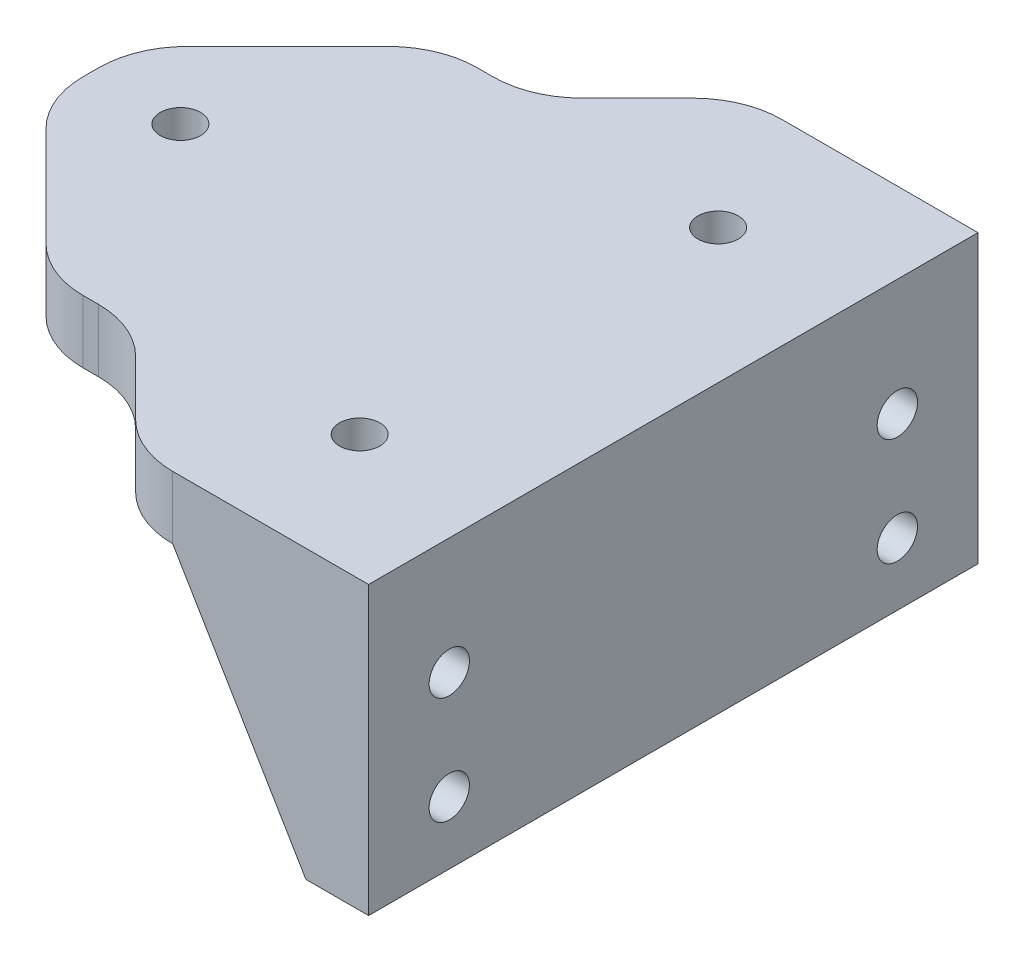
ISO-10303-21;
HEADER;
FILE_DESCRIPTION(('STEP AP214'),'2;1');
FILE_NAME('part.step','',(''),(''),'','','');
FILE_SCHEMA(('AUTOMOTIVE_DESIGN { 1 0 10303 214 1 1 1 1 }'));
ENDSEC;
DATA;
#1=APPLICATION_CONTEXT('core data for automotive mechanical design processes');
#2=APPLICATION_PROTOCOL_DEFINITION('international standard','automotive_design',2000,#1);
#3=PRODUCT_CONTEXT('',#1,'mechanical');
#4=PRODUCT('Part','Part','',(#3));
#5=PRODUCT_RELATED_PRODUCT_CATEGORY('part','',(#4));
#6=PRODUCT_DEFINITION_FORMATION('','',#4);
#7=PRODUCT_DEFINITION_CONTEXT('part definition',#1,'design');
#8=PRODUCT_DEFINITION('design','',#6,#7);
#9=PRODUCT_DEFINITION_SHAPE('','',#8);
#10=(LENGTH_UNIT() NAMED_UNIT(*) SI_UNIT(.MILLI.,.METRE.));
#11=(NAMED_UNIT(*) PLANE_ANGLE_UNIT() SI_UNIT($,.RADIAN.));
#12=(NAMED_UNIT(*) SI_UNIT($,.STERADIAN.) SOLID_ANGLE_UNIT());
#13=UNCERTAINTY_MEASURE_WITH_UNIT(LENGTH_MEASURE(1.E-05),#10,'distance_accuracy_value','');
#14=(GEOMETRIC_REPRESENTATION_CONTEXT(3) GLOBAL_UNCERTAINTY_ASSIGNED_CONTEXT((#13)) GLOBAL_UNIT_ASSIGNED_CONTEXT((#10,
#11,#12)) REPRESENTATION_CONTEXT('',''));
#15=CARTESIAN_POINT('',(0.,0.,0.));
#16=DIRECTION('',(0.,0.,1.));
#17=DIRECTION('',(1.,0.,0.));
#18=AXIS2_PLACEMENT_3D('',#15,#16,#17);
#19=CARTESIAN_POINT('',(58.,-25.,0.));
#20=DIRECTION('',(1.,0.,0.));
#21=DIRECTION('',(0.,0.,-1.));
#22=AXIS2_PLACEMENT_3D('',#19,#20,#21);
#23=PLANE('',#22);
#24=CARTESIAN_POINT('',(58.,-6.,-59.));
#25=DIRECTION('',(1.,0.,0.));
#26=DIRECTION('',(0.,0.,-1.));
#27=AXIS2_PLACEMENT_3D('',#24,#25,#26);
#28=CIRCLE('',#27,2.24999999999999);
#29=CARTESIAN_POINT('',(58.,-6.,-61.25));
#30=VERTEX_POINT('',#29);
#31=EDGE_CURVE('E873',#30,#30,#28,.T.);
#32=ORIENTED_EDGE('',*,*,#31,.T.);
#33=EDGE_LOOP('',(#32));
#34=FACE_BOUND('',#33,.T.);
#35=CARTESIAN_POINT('',(58.,-18.,-59.));
#36=DIRECTION('',(1.,0.,0.));
#37=DIRECTION('',(0.,0.,-1.));
#38=AXIS2_PLACEMENT_3D('',#35,#36,#37);
#39=CIRCLE('',#38,2.24999999999999);
#40=CARTESIAN_POINT('',(58.,-18.,-61.25));
#41=VERTEX_POINT('',#40);
#42=EDGE_CURVE('E43',#41,#41,#39,.T.);
#43=ORIENTED_EDGE('',*,*,#42,.T.);
#44=EDGE_LOOP('',(#43));
#45=FACE_BOUND('',#44,.T.);
#46=CARTESIAN_POINT('',(58.,-6.,-9.));
#47=DIRECTION('',(1.,0.,0.));
#48=DIRECTION('',(0.,0.,-1.));
#49=AXIS2_PLACEMENT_3D('',#46,#47,#48);
#50=CIRCLE('',#49,2.24999999999999);
#51=CARTESIAN_POINT('',(58.,-6.,-11.25));
#52=VERTEX_POINT('',#51);
#53=EDGE_CURVE('E428',#52,#52,#50,.T.);
#54=ORIENTED_EDGE('',*,*,#53,.T.);
#55=EDGE_LOOP('',(#54));
#56=FACE_BOUND('',#55,.T.);
#57=CARTESIAN_POINT('',(58.,-18.,-9.));
#58=DIRECTION('',(1.,0.,0.));
#59=DIRECTION('',(0.,0.,-1.));
#60=AXIS2_PLACEMENT_3D('',#57,#58,#59);
#61=CIRCLE('',#60,2.24999999999999);
#62=CARTESIAN_POINT('',(58.,-18.,-11.25));
#63=VERTEX_POINT('',#62);
#64=EDGE_CURVE('E220',#63,#63,#61,.T.);
#65=ORIENTED_EDGE('',*,*,#64,.T.);
#66=EDGE_LOOP('',(#65));
#67=FACE_BOUND('',#66,.T.);
#68=DIRECTION('',(0.,-1.,0.));
#69=VECTOR('',#68,1.);
#70=CARTESIAN_POINT('',(58.,-25.,-65.));
#71=LINE('',#70,#69);
#72=CARTESIAN_POINT('',(58.,0.,-65.));
#73=VERTEX_POINT('',#72);
#74=CARTESIAN_POINT('',(58.,-25.,-65.));
#75=VERTEX_POINT('',#74);
#76=EDGE_CURVE('E192',#73,#75,#71,.T.);
#77=ORIENTED_EDGE('',*,*,#76,.T.);
#78=DIRECTION('',(0.,0.,-1.));
#79=VECTOR('',#78,1.);
#80=CARTESIAN_POINT('',(58.,-25.,0.));
#81=LINE('',#80,#79);
#82=CARTESIAN_POINT('',(58.,-25.,-3.));
#83=VERTEX_POINT('',#82);
#84=EDGE_CURVE('E450',#83,#75,#81,.T.);
#85=ORIENTED_EDGE('',*,*,#84,.F.);
#86=DIRECTION('',(0.,1.,0.));
#87=VECTOR('',#86,1.);
#88=CARTESIAN_POINT('',(58.,0.,-3.));
#89=LINE('',#88,#87);
#90=CARTESIAN_POINT('',(58.,0.,-3.));
#91=VERTEX_POINT('',#90);
#92=EDGE_CURVE('E217',#83,#91,#89,.T.);
#93=ORIENTED_EDGE('',*,*,#92,.T.);
#94=DIRECTION('',(0.,0.,-1.));
#95=VECTOR('',#94,1.);
#96=CARTESIAN_POINT('',(58.,0.,0.));
#97=LINE('',#96,#95);
#98=EDGE_CURVE('E210',#91,#73,#97,.T.);
#99=ORIENTED_EDGE('',*,*,#98,.T.);
#100=EDGE_LOOP('',(#77,#85,#93,#99));
#101=FACE_BOUND('',#100,.T.);
#102=ADVANCED_FACE('F39',(#34,#45,#56,#67,#101),#23,.F.);
#103=CARTESIAN_POINT('',(0.,7.,0.));
#104=DIRECTION('',(1.,0.,0.));
#105=DIRECTION('',(0.,0.,-1.));
#106=AXIS2_PLACEMENT_3D('',#103,#104,#105);
#107=PLANE('',#106);
#108=DIRECTION('',(0.,0.,1.));
#109=VECTOR('',#108,1.);
#110=CARTESIAN_POINT('',(0.,7.,0.));
#111=LINE('',#110,#109);
#112=CARTESIAN_POINT('',(0.,7.,-34.8578643762691));
#113=VERTEX_POINT('',#112);
#114=CARTESIAN_POINT('',(0.,7.,-33.1421356237309));
#115=VERTEX_POINT('',#114);
#116=EDGE_CURVE('E316',#113,#115,#111,.T.);
#117=ORIENTED_EDGE('',*,*,#116,.F.);
#118=DIRECTION('',(0.,-1.,0.));
#119=VECTOR('',#118,1.);
#120=CARTESIAN_POINT('',(0.,7.,-34.8578643762691));
#121=LINE('',#120,#119);
#122=CARTESIAN_POINT('',(0.,0.,-34.8578643762691));
#123=VERTEX_POINT('',#122);
#124=EDGE_CURVE('E393',#113,#123,#121,.T.);
#125=ORIENTED_EDGE('',*,*,#124,.T.);
#126=DIRECTION('',(0.,0.,1.));
#127=VECTOR('',#126,1.);
#128=CARTESIAN_POINT('',(0.,0.,0.));
#129=LINE('',#128,#127);
#130=CARTESIAN_POINT('',(0.,0.,-33.1421356237309));
#131=VERTEX_POINT('',#130);
#132=EDGE_CURVE('E315',#123,#131,#129,.T.);
#133=ORIENTED_EDGE('',*,*,#132,.T.);
#134=DIRECTION('',(0.,-1.,0.));
#135=VECTOR('',#134,1.);
#136=CARTESIAN_POINT('',(0.,7.,-33.1421356237309));
#137=LINE('',#136,#135);
#138=EDGE_CURVE('E390',#131,#115,#137,.F.);
#139=ORIENTED_EDGE('',*,*,#138,.T.);
#140=EDGE_LOOP('',(#117,#125,#133,#139));
#141=FACE_BOUND('',#140,.T.);
#142=ADVANCED_FACE('F515',(#141),#107,.F.);
#143=CARTESIAN_POINT('',(0.,7.,0.));
#144=DIRECTION('',(0.,0.,-1.));
#145=DIRECTION('',(-1.,0.,0.));
#146=AXIS2_PLACEMENT_3D('',#143,#144,#145);
#147=PLANE('',#146);
#148=DIRECTION('',(1.,0.,0.));
#149=VECTOR('',#148,1.);
#150=CARTESIAN_POINT('',(0.,7.,0.));
#151=LINE('',#150,#149);
#152=CARTESIAN_POINT('',(43.1421356237305,7.,0.));
#153=VERTEX_POINT('',#152);
#154=CARTESIAN_POINT('',(65.,7.,0.));
#155=VERTEX_POINT('',#154);
#156=EDGE_CURVE('E320',#153,#155,#151,.T.);
#157=ORIENTED_EDGE('',*,*,#156,.F.);
#158=DIRECTION('',(0.,-1.,0.));
#159=VECTOR('',#158,1.);
#160=CARTESIAN_POINT('',(43.1421356237305,7.,0.));
#161=LINE('',#160,#159);
#162=CARTESIAN_POINT('',(43.1421356237305,0.,0.));
#163=VERTEX_POINT('',#162);
#164=EDGE_CURVE('E410',#153,#163,#161,.T.);
#165=ORIENTED_EDGE('',*,*,#164,.T.);
#166=DIRECTION('',(0.510897540155009,-0.85964161338523,0.));
#167=VECTOR('',#166,1.);
#168=CARTESIAN_POINT('',(58.,-25.,0.));
#169=LINE('',#168,#167);
#170=CARTESIAN_POINT('',(58.,-25.,0.));
#171=VERTEX_POINT('',#170);
#172=EDGE_CURVE('E857',#163,#171,#169,.T.);
#173=ORIENTED_EDGE('',*,*,#172,.T.);
#174=DIRECTION('',(-1.,0.,0.));
#175=VECTOR('',#174,1.);
#176=CARTESIAN_POINT('',(65.,-25.,0.));
#177=LINE('',#176,#175);
#178=CARTESIAN_POINT('',(65.,-25.,0.));
#179=VERTEX_POINT('',#178);
#180=EDGE_CURVE('E225',#179,#171,#177,.T.);
#181=ORIENTED_EDGE('',*,*,#180,.F.);
#182=DIRECTION('',(0.,-1.,0.));
#183=VECTOR('',#182,1.);
#184=CARTESIAN_POINT('',(65.,0.,0.));
#185=LINE('',#184,#183);
#186=EDGE_CURVE('E234',#155,#179,#185,.T.);
#187=ORIENTED_EDGE('',*,*,#186,.F.);
#188=EDGE_LOOP('',(#157,#165,#173,#181,#187));
#189=FACE_BOUND('',#188,.T.);
#190=ADVANCED_FACE('F480',(#189),#147,.F.);
#191=CARTESIAN_POINT('',(0.,7.,-68.));
#192=DIRECTION('',(0.,0.,1.));
#193=DIRECTION('',(1.,0.,0.));
#194=AXIS2_PLACEMENT_3D('',#191,#192,#193);
#195=PLANE('',#194);
#196=DIRECTION('',(0.,1.,0.));
#197=VECTOR('',#196,1.);
#198=CARTESIAN_POINT('',(65.,0.,-68.));
#199=LINE('',#198,#197);
#200=CARTESIAN_POINT('',(65.,-25.,-68.));
#201=VERTEX_POINT('',#200);
#202=CARTESIAN_POINT('',(65.,7.,-68.));
#203=VERTEX_POINT('',#202);
#204=EDGE_CURVE('E237',#201,#203,#199,.T.);
#205=ORIENTED_EDGE('',*,*,#204,.F.);
#206=DIRECTION('',(1.,0.,0.));
#207=VECTOR('',#206,1.);
#208=CARTESIAN_POINT('',(65.,-25.,-68.));
#209=LINE('',#208,#207);
#210=CARTESIAN_POINT('',(58.,-25.,-68.));
#211=VERTEX_POINT('',#210);
#212=EDGE_CURVE('E232',#211,#201,#209,.T.);
#213=ORIENTED_EDGE('',*,*,#212,.F.);
#214=DIRECTION('',(-0.51089754015501,0.859641613385229,0.));
#215=VECTOR('',#214,1.);
#216=CARTESIAN_POINT('',(43.1421356237305,0.,-68.));
#217=LINE('',#216,#215);
#218=CARTESIAN_POINT('',(43.1421356237305,0.,-68.));
#219=VERTEX_POINT('',#218);
#220=EDGE_CURVE('E214',#211,#219,#217,.T.);
#221=ORIENTED_EDGE('',*,*,#220,.T.);
#222=DIRECTION('',(0.,-1.,0.));
#223=VECTOR('',#222,1.);
#224=CARTESIAN_POINT('',(43.1421356237305,7.,-68.));
#225=LINE('',#224,#223);
#226=CARTESIAN_POINT('',(43.1421356237305,7.,-68.));
#227=VERTEX_POINT('',#226);
#228=EDGE_CURVE('E355',#219,#227,#225,.F.);
#229=ORIENTED_EDGE('',*,*,#228,.T.);
#230=DIRECTION('',(-1.,0.,0.));
#231=VECTOR('',#230,1.);
#232=CARTESIAN_POINT('',(0.,7.,-68.));
#233=LINE('',#232,#231);
#234=EDGE_CURVE('E323',#203,#227,#233,.T.);
#235=ORIENTED_EDGE('',*,*,#234,.F.);
#236=EDGE_LOOP('',(#205,#213,#221,#229,#235));
#237=FACE_BOUND('',#236,.T.);
#238=ADVANCED_FACE('F468',(#237),#195,.F.);
#239=CARTESIAN_POINT('',(0.,7.,0.));
#240=DIRECTION('',(0.,-1.,0.));
#241=DIRECTION('',(0.,0.,-1.));
#242=AXIS2_PLACEMENT_3D('',#239,#240,#241);
#243=PLANE('',#242);
#244=CARTESIAN_POINT('',(50.,7.,-54.));
#245=DIRECTION('',(0.,-1.,0.));
#246=DIRECTION('',(0.,0.,-1.));
#247=AXIS2_PLACEMENT_3D('',#244,#245,#246);
#248=CIRCLE('',#247,2.25);
#249=CARTESIAN_POINT('',(50.,7.,-56.25));
#250=VERTEX_POINT('',#249);
#251=EDGE_CURVE('E295',#250,#250,#248,.T.);
#252=ORIENTED_EDGE('',*,*,#251,.T.);
#253=EDGE_LOOP('',(#252));
#254=FACE_BOUND('',#253,.T.);
#255=CARTESIAN_POINT('',(50.,7.,-14.));
#256=DIRECTION('',(0.,-1.,0.));
#257=DIRECTION('',(0.,0.,-1.));
#258=AXIS2_PLACEMENT_3D('',#255,#256,#257);
#259=CIRCLE('',#258,2.25);
#260=CARTESIAN_POINT('',(50.,7.,-16.25));
#261=VERTEX_POINT('',#260);
#262=EDGE_CURVE('E303',#261,#261,#259,.T.);
#263=ORIENTED_EDGE('',*,*,#262,.T.);
#264=EDGE_LOOP('',(#263));
#265=FACE_BOUND('',#264,.T.);
#266=CARTESIAN_POINT('',(10.,7.,-34.));
#267=DIRECTION('',(0.,-1.,0.));
#268=DIRECTION('',(0.,0.,-1.));
#269=AXIS2_PLACEMENT_3D('',#266,#267,#268);
#270=CIRCLE('',#269,2.25);
#271=CARTESIAN_POINT('',(10.,7.,-36.25));
#272=VERTEX_POINT('',#271);
#273=EDGE_CURVE('E311',#272,#272,#270,.T.);
#274=ORIENTED_EDGE('',*,*,#273,.T.);
#275=EDGE_LOOP('',(#274));
#276=FACE_BOUND('',#275,.T.);
#277=ORIENTED_EDGE('',*,*,#234,.T.);
#278=CARTESIAN_POINT('',(43.1421356237305,7.,-58.));
#279=DIRECTION('',(0.,-1.,0.));
#280=DIRECTION('',(0.,0.,-1.));
#281=AXIS2_PLACEMENT_3D('',#278,#279,#280);
#282=CIRCLE('',#281,10.);
#283=CARTESIAN_POINT('',(36.071067811865,7.,-65.0710678118654));
#284=VERTEX_POINT('',#283);
#285=EDGE_CURVE('E373',#227,#284,#282,.F.);
#286=ORIENTED_EDGE('',*,*,#285,.T.);
#287=DIRECTION('',(-0.707106781186542,0.,0.707106781186553));
#288=VECTOR('',#287,1.);
#289=CARTESIAN_POINT('',(38.9999999999995,7.,-68.));
#290=LINE('',#289,#288);
#291=CARTESIAN_POINT('',(29.9289321881342,7.,-58.9289321881346));
#292=VERTEX_POINT('',#291);
#293=EDGE_CURVE('E274',#284,#292,#290,.T.);
#294=ORIENTED_EDGE('',*,*,#293,.T.);
#295=CARTESIAN_POINT('',(22.8578643762687,7.,-66.));
#296=DIRECTION('',(0.,-1.,0.));
#297=DIRECTION('',(0.,0.,-1.));
#298=AXIS2_PLACEMENT_3D('',#295,#296,#297);
#299=CIRCLE('',#298,10.);
#300=CARTESIAN_POINT('',(22.8578643762687,7.,-56.));
#301=VERTEX_POINT('',#300);
#302=EDGE_CURVE('E424',#292,#301,#299,.T.);
#303=ORIENTED_EDGE('',*,*,#302,.T.);
#304=DIRECTION('',(-1.,0.,0.));
#305=VECTOR('',#304,1.);
#306=CARTESIAN_POINT('',(26.9999999999997,7.,-56.));
#307=LINE('',#306,#305);
#308=CARTESIAN_POINT('',(21.1421356237307,7.,-56.));
#309=VERTEX_POINT('',#308);
#310=EDGE_CURVE('E263',#301,#309,#307,.T.);
#311=ORIENTED_EDGE('',*,*,#310,.T.);
#312=CARTESIAN_POINT('',(21.1421356237307,7.,-46.));
#313=DIRECTION('',(0.,-1.,0.));
#314=DIRECTION('',(0.,0.,-1.));
#315=AXIS2_PLACEMENT_3D('',#312,#313,#314);
#316=CIRCLE('',#315,10.);
#317=CARTESIAN_POINT('',(14.0710678118652,7.,-53.0710678118654));
#318=VERTEX_POINT('',#317);
#319=EDGE_CURVE('E370',#309,#318,#316,.F.);
#320=ORIENTED_EDGE('',*,*,#319,.T.);
#321=DIRECTION('',(-0.707106781186541,0.,0.707106781186554));
#322=VECTOR('',#321,1.);
#323=CARTESIAN_POINT('',(16.9999999999997,7.,-56.));
#324=LINE('',#323,#322);
#325=CARTESIAN_POINT('',(2.92893218813447,7.,-41.9289321881345));
#326=VERTEX_POINT('',#325);
#327=EDGE_CURVE('E270',#318,#326,#324,.T.);
#328=ORIENTED_EDGE('',*,*,#327,.T.);
#329=CARTESIAN_POINT('',(10.,7.,-34.8578643762691));
#330=DIRECTION('',(0.,-1.,0.));
#331=DIRECTION('',(0.,0.,-1.));
#332=AXIS2_PLACEMENT_3D('',#329,#330,#331);
#333=CIRCLE('',#332,10.);
#334=EDGE_CURVE('E367',#326,#113,#333,.F.);
#335=ORIENTED_EDGE('',*,*,#334,.T.);
#336=ORIENTED_EDGE('',*,*,#116,.T.);
#337=CARTESIAN_POINT('',(10.,7.,-33.1421356237309));
#338=DIRECTION('',(0.,-1.,0.));
#339=DIRECTION('',(0.,0.,-1.));
#340=AXIS2_PLACEMENT_3D('',#337,#338,#339);
#341=CIRCLE('',#340,10.);
#342=CARTESIAN_POINT('',(2.92893218813446,7.,-26.0710678118655));
#343=VERTEX_POINT('',#342);
#344=EDGE_CURVE('E364',#115,#343,#341,.F.);
#345=ORIENTED_EDGE('',*,*,#344,.T.);
#346=DIRECTION('',(0.707106781186541,0.,0.707106781186554));
#347=VECTOR('',#346,1.);
#348=CARTESIAN_POINT('',(16.9999999999997,7.,-12.));
#349=LINE('',#348,#347);
#350=CARTESIAN_POINT('',(14.0710678118652,7.,-14.9289321881346));
#351=VERTEX_POINT('',#350);
#352=EDGE_CURVE('E246',#343,#351,#349,.T.);
#353=ORIENTED_EDGE('',*,*,#352,.T.);
#354=CARTESIAN_POINT('',(21.1421356237307,7.,-22.));
#355=DIRECTION('',(0.,-1.,0.));
#356=DIRECTION('',(0.,0.,-1.));
#357=AXIS2_PLACEMENT_3D('',#354,#355,#356);
#358=CIRCLE('',#357,10.);
#359=CARTESIAN_POINT('',(21.1421356237307,7.,-12.));
#360=VERTEX_POINT('',#359);
#361=EDGE_CURVE('E361',#351,#360,#358,.F.);
#362=ORIENTED_EDGE('',*,*,#361,.T.);
#363=DIRECTION('',(1.,0.,0.));
#364=VECTOR('',#363,1.);
#365=CARTESIAN_POINT('',(26.9999999999997,7.,-12.));
#366=LINE('',#365,#364);
#367=CARTESIAN_POINT('',(22.8578643762687,7.,-12.));
#368=VERTEX_POINT('',#367);
#369=EDGE_CURVE('E249',#360,#368,#366,.T.);
#370=ORIENTED_EDGE('',*,*,#369,.T.);
#371=CARTESIAN_POINT('',(22.8578643762687,7.,-2.));
#372=DIRECTION('',(0.,-1.,0.));
#373=DIRECTION('',(0.,0.,-1.));
#374=AXIS2_PLACEMENT_3D('',#371,#372,#373);
#375=CIRCLE('',#374,10.);
#376=CARTESIAN_POINT('',(29.9289321881342,7.,-9.07106781186541));
#377=VERTEX_POINT('',#376);
#378=EDGE_CURVE('E11',#368,#377,#375,.T.);
#379=ORIENTED_EDGE('',*,*,#378,.T.);
#380=DIRECTION('',(0.707106781186542,0.,0.707106781186553));
#381=VECTOR('',#380,1.);
#382=CARTESIAN_POINT('',(38.9999999999995,7.,0.));
#383=LINE('',#382,#381);
#384=CARTESIAN_POINT('',(36.071067811865,7.,-2.92893218813458));
#385=VERTEX_POINT('',#384);
#386=EDGE_CURVE('E254',#377,#385,#383,.T.);
#387=ORIENTED_EDGE('',*,*,#386,.T.);
#388=CARTESIAN_POINT('',(43.1421356237305,7.,-10.));
#389=DIRECTION('',(0.,-1.,0.));
#390=DIRECTION('',(0.,0.,-1.));
#391=AXIS2_PLACEMENT_3D('',#388,#389,#390);
#392=CIRCLE('',#391,10.);
#393=EDGE_CURVE('E358',#385,#153,#392,.F.);
#394=ORIENTED_EDGE('',*,*,#393,.T.);
#395=ORIENTED_EDGE('',*,*,#156,.T.);
#396=DIRECTION('',(0.,0.,1.));
#397=VECTOR('',#396,1.);
#398=CARTESIAN_POINT('',(65.,7.,0.));
#399=LINE('',#398,#397);
#400=EDGE_CURVE('E241',#203,#155,#399,.T.);
#401=ORIENTED_EDGE('',*,*,#400,.F.);
#402=EDGE_LOOP('',(#277,#286,#294,#303,#311,#320,#328,#335,#336,#345,#353,#362,#370,#379,#387,
#394,#395,#401));
#403=FACE_BOUND('',#402,.T.);
#404=ADVANCED_FACE('F474',(#254,#265,#276,#403),#243,.F.);
#405=CARTESIAN_POINT('',(0.,0.,0.));
#406=DIRECTION('',(0.,-1.,0.));
#407=DIRECTION('',(0.,0.,-1.));
#408=AXIS2_PLACEMENT_3D('',#405,#406,#407);
#409=PLANE('',#408);
#410=DIRECTION('',(0.,0.,-1.));
#411=VECTOR('',#410,1.);
#412=CARTESIAN_POINT('',(43.1421356237305,0.,-65.));
#413=LINE('',#412,#411);
#414=CARTESIAN_POINT('',(43.1421356237305,0.,-65.));
#415=VERTEX_POINT('',#414);
#416=EDGE_CURVE('E212',#415,#219,#413,.T.);
#417=ORIENTED_EDGE('',*,*,#416,.F.);
#418=DIRECTION('',(1.,0.,0.));
#419=VECTOR('',#418,1.);
#420=CARTESIAN_POINT('',(58.,0.,-65.));
#421=LINE('',#420,#419);
#422=EDGE_CURVE('E195',#415,#73,#421,.T.);
#423=ORIENTED_EDGE('',*,*,#422,.T.);
#424=ORIENTED_EDGE('',*,*,#98,.F.);
#425=DIRECTION('',(-1.,0.,0.));
#426=VECTOR('',#425,1.);
#427=CARTESIAN_POINT('',(43.1421356237305,0.,-3.));
#428=LINE('',#427,#426);
#429=CARTESIAN_POINT('',(43.1421356237305,0.,-3.));
#430=VERTEX_POINT('',#429);
#431=EDGE_CURVE('E861',#91,#430,#428,.T.);
#432=ORIENTED_EDGE('',*,*,#431,.T.);
#433=DIRECTION('',(0.,0.,1.));
#434=VECTOR('',#433,1.);
#435=CARTESIAN_POINT('',(43.1421356237305,0.,-3.));
#436=LINE('',#435,#434);
#437=EDGE_CURVE('E489',#430,#163,#436,.T.);
#438=ORIENTED_EDGE('',*,*,#437,.T.);
#439=CARTESIAN_POINT('',(43.1421356237305,0.,-10.));
#440=DIRECTION('',(0.,-1.,0.));
#441=DIRECTION('',(0.,0.,-1.));
#442=AXIS2_PLACEMENT_3D('',#439,#440,#441);
#443=CIRCLE('',#442,10.);
#444=CARTESIAN_POINT('',(36.071067811865,0.,-2.92893218813458));
#445=VERTEX_POINT('',#444);
#446=EDGE_CURVE('E337',#163,#445,#443,.T.);
#447=ORIENTED_EDGE('',*,*,#446,.T.);
#448=DIRECTION('',(0.707106781186542,0.,0.707106781186553));
#449=VECTOR('',#448,1.);
#450=CARTESIAN_POINT('',(38.9999999999995,0.,0.));
#451=LINE('',#450,#449);
#452=CARTESIAN_POINT('',(29.9289321881342,0.,-9.07106781186541));
#453=VERTEX_POINT('',#452);
#454=EDGE_CURVE('E250',#453,#445,#451,.T.);
#455=ORIENTED_EDGE('',*,*,#454,.F.);
#456=CARTESIAN_POINT('',(22.8578643762687,0.,-2.));
#457=DIRECTION('',(0.,-1.,0.));
#458=DIRECTION('',(0.,0.,-1.));
#459=AXIS2_PLACEMENT_3D('',#456,#457,#458);
#460=CIRCLE('',#459,10.);
#461=CARTESIAN_POINT('',(22.8578643762687,0.,-12.));
#462=VERTEX_POINT('',#461);
#463=EDGE_CURVE('E49',#453,#462,#460,.F.);
#464=ORIENTED_EDGE('',*,*,#463,.T.);
#465=DIRECTION('',(1.,0.,0.));
#466=VECTOR('',#465,1.);
#467=CARTESIAN_POINT('',(26.9999999999997,0.,-12.));
#468=LINE('',#467,#466);
#469=CARTESIAN_POINT('',(21.1421356237307,0.,-12.));
#470=VERTEX_POINT('',#469);
#471=EDGE_CURVE('E262',#470,#462,#468,.T.);
#472=ORIENTED_EDGE('',*,*,#471,.F.);
#473=CARTESIAN_POINT('',(21.1421356237307,0.,-22.));
#474=DIRECTION('',(0.,-1.,0.));
#475=DIRECTION('',(0.,0.,-1.));
#476=AXIS2_PLACEMENT_3D('',#473,#474,#475);
#477=CIRCLE('',#476,10.);
#478=CARTESIAN_POINT('',(14.0710678118652,0.,-14.9289321881346));
#479=VERTEX_POINT('',#478);
#480=EDGE_CURVE('E340',#470,#479,#477,.T.);
#481=ORIENTED_EDGE('',*,*,#480,.T.);
#482=DIRECTION('',(0.707106781186541,0.,0.707106781186554));
#483=VECTOR('',#482,1.);
#484=CARTESIAN_POINT('',(16.9999999999997,0.,-12.));
#485=LINE('',#484,#483);
#486=CARTESIAN_POINT('',(2.92893218813446,0.,-26.0710678118655));
#487=VERTEX_POINT('',#486);
#488=EDGE_CURVE('E259',#487,#479,#485,.T.);
#489=ORIENTED_EDGE('',*,*,#488,.F.);
#490=CARTESIAN_POINT('',(10.,0.,-33.1421356237309));
#491=DIRECTION('',(0.,-1.,0.));
#492=DIRECTION('',(0.,0.,-1.));
#493=AXIS2_PLACEMENT_3D('',#490,#491,#492);
#494=CIRCLE('',#493,10.);
#495=EDGE_CURVE('E343',#487,#131,#494,.T.);
#496=ORIENTED_EDGE('',*,*,#495,.T.);
#497=ORIENTED_EDGE('',*,*,#132,.F.);
#498=CARTESIAN_POINT('',(10.,0.,-34.8578643762691));
#499=DIRECTION('',(0.,-1.,0.));
#500=DIRECTION('',(0.,0.,-1.));
#501=AXIS2_PLACEMENT_3D('',#498,#499,#500);
#502=CIRCLE('',#501,10.);
#503=CARTESIAN_POINT('',(2.92893218813447,0.,-41.9289321881345));
#504=VERTEX_POINT('',#503);
#505=EDGE_CURVE('E346',#123,#504,#502,.T.);
#506=ORIENTED_EDGE('',*,*,#505,.T.);
#507=DIRECTION('',(-0.707106781186541,0.,0.707106781186554));
#508=VECTOR('',#507,1.);
#509=CARTESIAN_POINT('',(16.9999999999997,0.,-56.));
#510=LINE('',#509,#508);
#511=CARTESIAN_POINT('',(14.0710678118652,0.,-53.0710678118654));
#512=VERTEX_POINT('',#511);
#513=EDGE_CURVE('E245',#512,#504,#510,.T.);
#514=ORIENTED_EDGE('',*,*,#513,.F.);
#515=CARTESIAN_POINT('',(21.1421356237307,0.,-46.));
#516=DIRECTION('',(0.,-1.,0.));
#517=DIRECTION('',(0.,0.,-1.));
#518=AXIS2_PLACEMENT_3D('',#515,#516,#517);
#519=CIRCLE('',#518,10.);
#520=CARTESIAN_POINT('',(21.1421356237307,0.,-56.));
#521=VERTEX_POINT('',#520);
#522=EDGE_CURVE('E349',#512,#521,#519,.T.);
#523=ORIENTED_EDGE('',*,*,#522,.T.);
#524=DIRECTION('',(-1.,0.,0.));
#525=VECTOR('',#524,1.);
#526=CARTESIAN_POINT('',(26.9999999999997,0.,-56.));
#527=LINE('',#526,#525);
#528=CARTESIAN_POINT('',(22.8578643762687,0.,-56.));
#529=VERTEX_POINT('',#528);
#530=EDGE_CURVE('E275',#529,#521,#527,.T.);
#531=ORIENTED_EDGE('',*,*,#530,.F.);
#532=CARTESIAN_POINT('',(22.8578643762687,0.,-66.));
#533=DIRECTION('',(0.,-1.,0.));
#534=DIRECTION('',(0.,0.,-1.));
#535=AXIS2_PLACEMENT_3D('',#532,#533,#534);
#536=CIRCLE('',#535,10.);
#537=CARTESIAN_POINT('',(29.9289321881342,0.,-58.9289321881346));
#538=VERTEX_POINT('',#537);
#539=EDGE_CURVE('E421',#529,#538,#536,.F.);
#540=ORIENTED_EDGE('',*,*,#539,.T.);
#541=DIRECTION('',(-0.707106781186542,0.,0.707106781186553));
#542=VECTOR('',#541,1.);
#543=CARTESIAN_POINT('',(38.9999999999995,0.,-68.));
#544=LINE('',#543,#542);
#545=CARTESIAN_POINT('',(36.071067811865,0.,-65.0710678118654));
#546=VERTEX_POINT('',#545);
#547=EDGE_CURVE('E285',#546,#538,#544,.T.);
#548=ORIENTED_EDGE('',*,*,#547,.F.);
#549=CARTESIAN_POINT('',(43.1421356237305,0.,-58.));
#550=DIRECTION('',(0.,-1.,0.));
#551=DIRECTION('',(0.,0.,-1.));
#552=AXIS2_PLACEMENT_3D('',#549,#550,#551);
#553=CIRCLE('',#552,10.);
#554=EDGE_CURVE('E352',#546,#219,#553,.T.);
#555=ORIENTED_EDGE('',*,*,#554,.T.);
#556=EDGE_LOOP('',(#417,#423,#424,#432,#438,#447,#455,#464,#472,#481,#489,#496,#497,#506,#514,
#523,#531,#540,#548,#555));
#557=FACE_BOUND('',#556,.T.);
#558=CARTESIAN_POINT('',(50.,0.,-54.));
#559=DIRECTION('',(0.,-1.,0.));
#560=DIRECTION('',(0.,0.,-1.));
#561=AXIS2_PLACEMENT_3D('',#558,#559,#560);
#562=CIRCLE('',#561,2.24999999999999);
#563=CARTESIAN_POINT('',(50.,0.,-56.25));
#564=VERTEX_POINT('',#563);
#565=EDGE_CURVE('E258',#564,#564,#562,.T.);
#566=ORIENTED_EDGE('',*,*,#565,.F.);
#567=EDGE_LOOP('',(#566));
#568=FACE_BOUND('',#567,.T.);
#569=CARTESIAN_POINT('',(50.,0.,-14.));
#570=DIRECTION('',(0.,-1.,0.));
#571=DIRECTION('',(0.,0.,-1.));
#572=AXIS2_PLACEMENT_3D('',#569,#570,#571);
#573=CIRCLE('',#572,2.24999999999999);
#574=CARTESIAN_POINT('',(50.,0.,-16.25));
#575=VERTEX_POINT('',#574);
#576=EDGE_CURVE('E299',#575,#575,#573,.T.);
#577=ORIENTED_EDGE('',*,*,#576,.F.);
#578=EDGE_LOOP('',(#577));
#579=FACE_BOUND('',#578,.T.);
#580=CARTESIAN_POINT('',(10.,0.,-34.));
#581=DIRECTION('',(0.,-1.,0.));
#582=DIRECTION('',(0.,0.,-1.));
#583=AXIS2_PLACEMENT_3D('',#580,#581,#582);
#584=CIRCLE('',#583,2.24999999999999);
#585=CARTESIAN_POINT('',(10.,0.,-36.25));
#586=VERTEX_POINT('',#585);
#587=EDGE_CURVE('E307',#586,#586,#584,.T.);
#588=ORIENTED_EDGE('',*,*,#587,.F.);
#589=EDGE_LOOP('',(#588));
#590=FACE_BOUND('',#589,.T.);
#591=ADVANCED_FACE('F207',(#557,#568,#579,#590),#409,.T.);
#592=CARTESIAN_POINT('',(10.,0.,-34.));
#593=DIRECTION('',(0.,-1.,0.));
#594=DIRECTION('',(0.,0.,-1.));
#595=AXIS2_PLACEMENT_3D('',#592,#593,#594);
#596=CYLINDRICAL_SURFACE('',#595,2.24999999999999);
#597=ORIENTED_EDGE('',*,*,#273,.F.);
#598=EDGE_LOOP('',(#597));
#599=FACE_BOUND('',#598,.T.);
#600=ORIENTED_EDGE('',*,*,#587,.T.);
#601=EDGE_LOOP('',(#600));
#602=FACE_BOUND('',#601,.T.);
#603=ADVANCED_FACE('F587',(#599,#602),#596,.F.);
#604=CARTESIAN_POINT('',(50.,0.,-14.));
#605=DIRECTION('',(0.,-1.,0.));
#606=DIRECTION('',(0.,0.,-1.));
#607=AXIS2_PLACEMENT_3D('',#604,#605,#606);
#608=CYLINDRICAL_SURFACE('',#607,2.25);
#609=ORIENTED_EDGE('',*,*,#262,.F.);
#610=EDGE_LOOP('',(#609));
#611=FACE_BOUND('',#610,.T.);
#612=ORIENTED_EDGE('',*,*,#576,.T.);
#613=EDGE_LOOP('',(#612));
#614=FACE_BOUND('',#613,.T.);
#615=ADVANCED_FACE('F583',(#611,#614),#608,.F.);
#616=CARTESIAN_POINT('',(50.,0.,-54.));
#617=DIRECTION('',(0.,-1.,0.));
#618=DIRECTION('',(0.,0.,-1.));
#619=AXIS2_PLACEMENT_3D('',#616,#617,#618);
#620=CYLINDRICAL_SURFACE('',#619,2.25);
#621=ORIENTED_EDGE('',*,*,#251,.F.);
#622=EDGE_LOOP('',(#621));
#623=FACE_BOUND('',#622,.T.);
#624=ORIENTED_EDGE('',*,*,#565,.T.);
#625=EDGE_LOOP('',(#624));
#626=FACE_BOUND('',#625,.T.);
#627=ADVANCED_FACE('F580',(#623,#626),#620,.F.);
#628=CARTESIAN_POINT('',(16.9999999999997,7.,-56.));
#629=DIRECTION('',(0.707106781186554,0.,0.707106781186541));
#630=DIRECTION('',(0.707106781186541,0.,-0.707106781186554));
#631=AXIS2_PLACEMENT_3D('',#628,#629,#630);
#632=PLANE('',#631);
#633=ORIENTED_EDGE('',*,*,#327,.F.);
#634=DIRECTION('',(0.,-1.,0.));
#635=VECTOR('',#634,1.);
#636=CARTESIAN_POINT('',(14.0710678118652,7.,-53.0710678118654));
#637=LINE('',#636,#635);
#638=EDGE_CURVE('E386',#318,#512,#637,.T.);
#639=ORIENTED_EDGE('',*,*,#638,.T.);
#640=ORIENTED_EDGE('',*,*,#513,.T.);
#641=DIRECTION('',(0.,-1.,0.));
#642=VECTOR('',#641,1.);
#643=CARTESIAN_POINT('',(2.92893218813446,7.,-41.9289321881345));
#644=LINE('',#643,#642);
#645=EDGE_CURVE('E383',#504,#326,#644,.F.);
#646=ORIENTED_EDGE('',*,*,#645,.T.);
#647=EDGE_LOOP('',(#633,#639,#640,#646));
#648=FACE_BOUND('',#647,.T.);
#649=ADVANCED_FACE('F524',(#648),#632,.F.);
#650=CARTESIAN_POINT('',(26.9999999999997,7.,-56.));
#651=DIRECTION('',(0.,0.,1.));
#652=DIRECTION('',(1.,0.,0.));
#653=AXIS2_PLACEMENT_3D('',#650,#651,#652);
#654=PLANE('',#653);
#655=ORIENTED_EDGE('',*,*,#310,.F.);
#656=DIRECTION('',(0.,-1.,0.));
#657=VECTOR('',#656,1.);
#658=CARTESIAN_POINT('',(22.8578643762687,0.,-56.));
#659=LINE('',#658,#657);
#660=EDGE_CURVE('E379',#301,#529,#659,.T.);
#661=ORIENTED_EDGE('',*,*,#660,.T.);
#662=ORIENTED_EDGE('',*,*,#530,.T.);
#663=DIRECTION('',(0.,-1.,0.));
#664=VECTOR('',#663,1.);
#665=CARTESIAN_POINT('',(21.1421356237307,7.,-56.));
#666=LINE('',#665,#664);
#667=EDGE_CURVE('E376',#521,#309,#666,.F.);
#668=ORIENTED_EDGE('',*,*,#667,.T.);
#669=EDGE_LOOP('',(#655,#661,#662,#668));
#670=FACE_BOUND('',#669,.T.);
#671=ADVANCED_FACE('F533',(#670),#654,.F.);
#672=CARTESIAN_POINT('',(38.9999999999995,7.,-68.));
#673=DIRECTION('',(0.707106781186553,0.,0.707106781186542));
#674=DIRECTION('',(0.707106781186542,0.,-0.707106781186553));
#675=AXIS2_PLACEMENT_3D('',#672,#673,#674);
#676=PLANE('',#675);
#677=ORIENTED_EDGE('',*,*,#293,.F.);
#678=DIRECTION('',(0.,-1.,0.));
#679=VECTOR('',#678,1.);
#680=CARTESIAN_POINT('',(36.071067811865,7.,-65.0710678118654));
#681=LINE('',#680,#679);
#682=EDGE_CURVE('E333',#284,#546,#681,.T.);
#683=ORIENTED_EDGE('',*,*,#682,.T.);
#684=ORIENTED_EDGE('',*,*,#547,.T.);
#685=DIRECTION('',(0.,-1.,0.));
#686=VECTOR('',#685,1.);
#687=CARTESIAN_POINT('',(29.9289321881342,7.,-58.9289321881346));
#688=LINE('',#687,#686);
#689=EDGE_CURVE('E327',#538,#292,#688,.F.);
#690=ORIENTED_EDGE('',*,*,#689,.T.);
#691=EDGE_LOOP('',(#677,#683,#684,#690));
#692=FACE_BOUND('',#691,.T.);
#693=ADVANCED_FACE('F542',(#692),#676,.F.);
#694=CARTESIAN_POINT('',(38.9999999999995,7.,0.));
#695=DIRECTION('',(0.707106781186553,0.,-0.707106781186542));
#696=DIRECTION('',(-0.707106781186542,0.,-0.707106781186553));
#697=AXIS2_PLACEMENT_3D('',#694,#695,#696);
#698=PLANE('',#697);
#699=ORIENTED_EDGE('',*,*,#454,.T.);
#700=DIRECTION('',(0.,-1.,0.));
#701=VECTOR('',#700,1.);
#702=CARTESIAN_POINT('',(36.071067811865,7.,-2.92893218813458));
#703=LINE('',#702,#701);
#704=EDGE_CURVE('E418',#445,#385,#703,.F.);
#705=ORIENTED_EDGE('',*,*,#704,.T.);
#706=ORIENTED_EDGE('',*,*,#386,.F.);
#707=DIRECTION('',(0.,-1.,0.));
#708=VECTOR('',#707,1.);
#709=CARTESIAN_POINT('',(29.9289321881342,0.,-9.07106781186541));
#710=LINE('',#709,#708);
#711=EDGE_CURVE('E414',#377,#453,#710,.T.);
#712=ORIENTED_EDGE('',*,*,#711,.T.);
#713=EDGE_LOOP('',(#699,#705,#706,#712));
#714=FACE_BOUND('',#713,.T.);
#715=ADVANCED_FACE('F491',(#714),#698,.F.);
#716=CARTESIAN_POINT('',(26.9999999999997,7.,-12.));
#717=DIRECTION('',(0.,0.,-1.));
#718=DIRECTION('',(-1.,0.,0.));
#719=AXIS2_PLACEMENT_3D('',#716,#717,#718);
#720=PLANE('',#719);
#721=ORIENTED_EDGE('',*,*,#369,.F.);
#722=DIRECTION('',(0.,-1.,0.));
#723=VECTOR('',#722,1.);
#724=CARTESIAN_POINT('',(21.1421356237307,7.,-12.));
#725=LINE('',#724,#723);
#726=EDGE_CURVE('E406',#360,#470,#725,.T.);
#727=ORIENTED_EDGE('',*,*,#726,.T.);
#728=ORIENTED_EDGE('',*,*,#471,.T.);
#729=DIRECTION('',(0.,-1.,0.));
#730=VECTOR('',#729,1.);
#731=CARTESIAN_POINT('',(22.8578643762687,7.,-12.));
#732=LINE('',#731,#730);
#733=EDGE_CURVE('E403',#462,#368,#732,.F.);
#734=ORIENTED_EDGE('',*,*,#733,.T.);
#735=EDGE_LOOP('',(#721,#727,#728,#734));
#736=FACE_BOUND('',#735,.T.);
#737=ADVANCED_FACE('F500',(#736),#720,.F.);
#738=CARTESIAN_POINT('',(16.9999999999997,7.,-12.));
#739=DIRECTION('',(0.707106781186554,0.,-0.707106781186541));
#740=DIRECTION('',(-0.707106781186541,0.,-0.707106781186554));
#741=AXIS2_PLACEMENT_3D('',#738,#739,#740);
#742=PLANE('',#741);
#743=ORIENTED_EDGE('',*,*,#352,.F.);
#744=DIRECTION('',(0.,-1.,0.));
#745=VECTOR('',#744,1.);
#746=CARTESIAN_POINT('',(2.92893218813446,7.,-26.0710678118655));
#747=LINE('',#746,#745);
#748=EDGE_CURVE('E399',#343,#487,#747,.T.);
#749=ORIENTED_EDGE('',*,*,#748,.T.);
#750=ORIENTED_EDGE('',*,*,#488,.T.);
#751=DIRECTION('',(0.,-1.,0.));
#752=VECTOR('',#751,1.);
#753=CARTESIAN_POINT('',(14.0710678118652,7.,-14.9289321881346));
#754=LINE('',#753,#752);
#755=EDGE_CURVE('E65',#479,#351,#754,.F.);
#756=ORIENTED_EDGE('',*,*,#755,.T.);
#757=EDGE_LOOP('',(#743,#749,#750,#756));
#758=FACE_BOUND('',#757,.T.);
#759=ADVANCED_FACE('F506',(#758),#742,.F.);
#760=CARTESIAN_POINT('',(43.1421356237305,7.,-58.));
#761=DIRECTION('',(0.,-1.,0.));
#762=DIRECTION('',(0.,0.,-1.));
#763=AXIS2_PLACEMENT_3D('',#760,#761,#762);
#764=CYLINDRICAL_SURFACE('',#763,10.);
#765=ORIENTED_EDGE('',*,*,#285,.F.);
#766=ORIENTED_EDGE('',*,*,#228,.F.);
#767=ORIENTED_EDGE('',*,*,#554,.F.);
#768=ORIENTED_EDGE('',*,*,#682,.F.);
#769=EDGE_LOOP('',(#765,#766,#767,#768));
#770=FACE_BOUND('',#769,.T.);
#771=ADVANCED_FACE('F545',(#770),#764,.T.);
#772=CARTESIAN_POINT('',(22.8578643762687,7.,-66.));
#773=DIRECTION('',(0.,1.,0.));
#774=DIRECTION('',(0.,0.,1.));
#775=AXIS2_PLACEMENT_3D('',#772,#773,#774);
#776=CYLINDRICAL_SURFACE('',#775,10.);
#777=ORIENTED_EDGE('',*,*,#302,.F.);
#778=ORIENTED_EDGE('',*,*,#689,.F.);
#779=ORIENTED_EDGE('',*,*,#539,.F.);
#780=ORIENTED_EDGE('',*,*,#660,.F.);
#781=EDGE_LOOP('',(#777,#778,#779,#780));
#782=FACE_BOUND('',#781,.T.);
#783=ADVANCED_FACE('F537',(#782),#776,.F.);
#784=CARTESIAN_POINT('',(21.1421356237307,7.,-46.));
#785=DIRECTION('',(0.,-1.,0.));
#786=DIRECTION('',(0.,0.,-1.));
#787=AXIS2_PLACEMENT_3D('',#784,#785,#786);
#788=CYLINDRICAL_SURFACE('',#787,10.);
#789=ORIENTED_EDGE('',*,*,#319,.F.);
#790=ORIENTED_EDGE('',*,*,#667,.F.);
#791=ORIENTED_EDGE('',*,*,#522,.F.);
#792=ORIENTED_EDGE('',*,*,#638,.F.);
#793=EDGE_LOOP('',(#789,#790,#791,#792));
#794=FACE_BOUND('',#793,.T.);
#795=ADVANCED_FACE('F528',(#794),#788,.T.);
#796=CARTESIAN_POINT('',(10.,7.,-34.8578643762691));
#797=DIRECTION('',(0.,-1.,0.));
#798=DIRECTION('',(0.,0.,-1.));
#799=AXIS2_PLACEMENT_3D('',#796,#797,#798);
#800=CYLINDRICAL_SURFACE('',#799,10.);
#801=ORIENTED_EDGE('',*,*,#334,.F.);
#802=ORIENTED_EDGE('',*,*,#645,.F.);
#803=ORIENTED_EDGE('',*,*,#505,.F.);
#804=ORIENTED_EDGE('',*,*,#124,.F.);
#805=EDGE_LOOP('',(#801,#802,#803,#804));
#806=FACE_BOUND('',#805,.T.);
#807=ADVANCED_FACE('F519',(#806),#800,.T.);
#808=CARTESIAN_POINT('',(10.,7.,-33.1421356237309));
#809=DIRECTION('',(0.,-1.,0.));
#810=DIRECTION('',(0.,0.,-1.));
#811=AXIS2_PLACEMENT_3D('',#808,#809,#810);
#812=CYLINDRICAL_SURFACE('',#811,10.);
#813=ORIENTED_EDGE('',*,*,#344,.F.);
#814=ORIENTED_EDGE('',*,*,#138,.F.);
#815=ORIENTED_EDGE('',*,*,#495,.F.);
#816=ORIENTED_EDGE('',*,*,#748,.F.);
#817=EDGE_LOOP('',(#813,#814,#815,#816));
#818=FACE_BOUND('',#817,.T.);
#819=ADVANCED_FACE('F510',(#818),#812,.T.);
#820=CARTESIAN_POINT('',(21.1421356237307,7.,-22.));
#821=DIRECTION('',(0.,-1.,0.));
#822=DIRECTION('',(0.,0.,-1.));
#823=AXIS2_PLACEMENT_3D('',#820,#821,#822);
#824=CYLINDRICAL_SURFACE('',#823,10.);
#825=ORIENTED_EDGE('',*,*,#361,.F.);
#826=ORIENTED_EDGE('',*,*,#755,.F.);
#827=ORIENTED_EDGE('',*,*,#480,.F.);
#828=ORIENTED_EDGE('',*,*,#726,.F.);
#829=EDGE_LOOP('',(#825,#826,#827,#828));
#830=FACE_BOUND('',#829,.T.);
#831=ADVANCED_FACE('F504',(#830),#824,.T.);
#832=CARTESIAN_POINT('',(43.1421356237305,7.,-10.));
#833=DIRECTION('',(0.,-1.,0.));
#834=DIRECTION('',(0.,0.,-1.));
#835=AXIS2_PLACEMENT_3D('',#832,#833,#834);
#836=CYLINDRICAL_SURFACE('',#835,10.);
#837=ORIENTED_EDGE('',*,*,#393,.F.);
#838=ORIENTED_EDGE('',*,*,#704,.F.);
#839=ORIENTED_EDGE('',*,*,#446,.F.);
#840=ORIENTED_EDGE('',*,*,#164,.F.);
#841=EDGE_LOOP('',(#837,#838,#839,#840));
#842=FACE_BOUND('',#841,.T.);
#843=ADVANCED_FACE('F485',(#842),#836,.T.);
#844=CARTESIAN_POINT('',(22.8578643762687,7.,-2.));
#845=DIRECTION('',(0.,1.,0.));
#846=DIRECTION('',(0.,0.,1.));
#847=AXIS2_PLACEMENT_3D('',#844,#845,#846);
#848=CYLINDRICAL_SURFACE('',#847,10.);
#849=ORIENTED_EDGE('',*,*,#378,.F.);
#850=ORIENTED_EDGE('',*,*,#733,.F.);
#851=ORIENTED_EDGE('',*,*,#463,.F.);
#852=ORIENTED_EDGE('',*,*,#711,.F.);
#853=EDGE_LOOP('',(#849,#850,#851,#852));
#854=FACE_BOUND('',#853,.T.);
#855=ADVANCED_FACE('F41',(#854),#848,.F.);
#856=CARTESIAN_POINT('',(65.,0.,0.));
#857=DIRECTION('',(-1.,0.,0.));
#858=DIRECTION('',(0.,0.,1.));
#859=AXIS2_PLACEMENT_3D('',#856,#857,#858);
#860=PLANE('',#859);
#861=CARTESIAN_POINT('',(65.,-6.,-59.));
#862=DIRECTION('',(1.,0.,0.));
#863=DIRECTION('',(0.,0.,-1.));
#864=AXIS2_PLACEMENT_3D('',#861,#862,#863);
#865=CIRCLE('',#864,2.24999999999999);
#866=CARTESIAN_POINT('',(65.,-6.,-61.25));
#867=VERTEX_POINT('',#866);
#868=EDGE_CURVE('E870',#867,#867,#865,.T.);
#869=ORIENTED_EDGE('',*,*,#868,.F.);
#870=EDGE_LOOP('',(#869));
#871=FACE_BOUND('',#870,.T.);
#872=CARTESIAN_POINT('',(65.,-18.,-59.));
#873=DIRECTION('',(1.,0.,0.));
#874=DIRECTION('',(0.,0.,-1.));
#875=AXIS2_PLACEMENT_3D('',#872,#873,#874);
#876=CIRCLE('',#875,2.24999999999999);
#877=CARTESIAN_POINT('',(65.,-18.,-61.25));
#878=VERTEX_POINT('',#877);
#879=EDGE_CURVE('E444',#878,#878,#876,.T.);
#880=ORIENTED_EDGE('',*,*,#879,.F.);
#881=EDGE_LOOP('',(#880));
#882=FACE_BOUND('',#881,.T.);
#883=CARTESIAN_POINT('',(65.,-6.,-9.));
#884=DIRECTION('',(1.,0.,0.));
#885=DIRECTION('',(0.,0.,-1.));
#886=AXIS2_PLACEMENT_3D('',#883,#884,#885);
#887=CIRCLE('',#886,2.24999999999999);
#888=CARTESIAN_POINT('',(65.,-6.,-11.25));
#889=VERTEX_POINT('',#888);
#890=EDGE_CURVE('E431',#889,#889,#887,.T.);
#891=ORIENTED_EDGE('',*,*,#890,.F.);
#892=EDGE_LOOP('',(#891));
#893=FACE_BOUND('',#892,.T.);
#894=CARTESIAN_POINT('',(65.,-18.,-9.));
#895=DIRECTION('',(1.,0.,0.));
#896=DIRECTION('',(0.,0.,-1.));
#897=AXIS2_PLACEMENT_3D('',#894,#895,#896);
#898=CIRCLE('',#897,2.24999999999999);
#899=CARTESIAN_POINT('',(65.,-18.,-11.25));
#900=VERTEX_POINT('',#899);
#901=EDGE_CURVE('E228',#900,#900,#898,.T.);
#902=ORIENTED_EDGE('',*,*,#901,.F.);
#903=EDGE_LOOP('',(#902));
#904=FACE_BOUND('',#903,.T.);
#905=ORIENTED_EDGE('',*,*,#186,.T.);
#906=DIRECTION('',(0.,0.,1.));
#907=VECTOR('',#906,1.);
#908=CARTESIAN_POINT('',(65.,-25.,0.));
#909=LINE('',#908,#907);
#910=EDGE_CURVE('E219',#201,#179,#909,.T.);
#911=ORIENTED_EDGE('',*,*,#910,.F.);
#912=ORIENTED_EDGE('',*,*,#204,.T.);
#913=ORIENTED_EDGE('',*,*,#400,.T.);
#914=EDGE_LOOP('',(#905,#911,#912,#913));
#915=FACE_BOUND('',#914,.T.);
#916=ADVANCED_FACE('F471',(#871,#882,#893,#904,#915),#860,.F.);
#917=CARTESIAN_POINT('',(0.,-25.,0.));
#918=DIRECTION('',(0.,1.,0.));
#919=DIRECTION('',(0.,0.,1.));
#920=AXIS2_PLACEMENT_3D('',#917,#918,#919);
#921=PLANE('',#920);
#922=ORIENTED_EDGE('',*,*,#910,.T.);
#923=ORIENTED_EDGE('',*,*,#180,.T.);
#924=EDGE_CURVE('E451',#171,#83,#81,.T.);
#925=ORIENTED_EDGE('',*,*,#924,.T.);
#926=ORIENTED_EDGE('',*,*,#84,.T.);
#927=DIRECTION('',(0.,0.,-1.));
#928=VECTOR('',#927,1.);
#929=CARTESIAN_POINT('',(58.,-25.,-65.));
#930=LINE('',#929,#928);
#931=EDGE_CURVE('E460',#75,#211,#930,.T.);
#932=ORIENTED_EDGE('',*,*,#931,.T.);
#933=ORIENTED_EDGE('',*,*,#212,.T.);
#934=EDGE_LOOP('',(#922,#923,#925,#926,#932,#933));
#935=FACE_BOUND('',#934,.T.);
#936=ADVANCED_FACE('F459',(#935),#921,.F.);
#937=CARTESIAN_POINT('',(65.,-18.,-9.));
#938=DIRECTION('',(1.,0.,0.));
#939=DIRECTION('',(0.,0.,-1.));
#940=AXIS2_PLACEMENT_3D('',#937,#938,#939);
#941=CYLINDRICAL_SURFACE('',#940,2.24999999999999);
#942=ORIENTED_EDGE('',*,*,#901,.T.);
#943=EDGE_LOOP('',(#942));
#944=FACE_BOUND('',#943,.T.);
#945=ORIENTED_EDGE('',*,*,#64,.F.);
#946=EDGE_LOOP('',(#945));
#947=FACE_BOUND('',#946,.T.);
#948=ADVANCED_FACE('F717',(#944,#947),#941,.F.);
#949=CARTESIAN_POINT('',(65.,-6.,-9.));
#950=DIRECTION('',(1.,0.,0.));
#951=DIRECTION('',(0.,0.,-1.));
#952=AXIS2_PLACEMENT_3D('',#949,#950,#951);
#953=CYLINDRICAL_SURFACE('',#952,2.24999999999999);
#954=ORIENTED_EDGE('',*,*,#890,.T.);
#955=EDGE_LOOP('',(#954));
#956=FACE_BOUND('',#955,.T.);
#957=ORIENTED_EDGE('',*,*,#53,.F.);
#958=EDGE_LOOP('',(#957));
#959=FACE_BOUND('',#958,.T.);
#960=ADVANCED_FACE('F723',(#956,#959),#953,.F.);
#961=CARTESIAN_POINT('',(65.,-18.,-59.));
#962=DIRECTION('',(1.,0.,0.));
#963=DIRECTION('',(0.,0.,-1.));
#964=AXIS2_PLACEMENT_3D('',#961,#962,#963);
#965=CYLINDRICAL_SURFACE('',#964,2.24999999999999);
#966=ORIENTED_EDGE('',*,*,#879,.T.);
#967=EDGE_LOOP('',(#966));
#968=FACE_BOUND('',#967,.T.);
#969=ORIENTED_EDGE('',*,*,#42,.F.);
#970=EDGE_LOOP('',(#969));
#971=FACE_BOUND('',#970,.T.);
#972=ADVANCED_FACE('F730',(#968,#971),#965,.F.);
#973=CARTESIAN_POINT('',(65.,-6.,-59.));
#974=DIRECTION('',(1.,0.,0.));
#975=DIRECTION('',(0.,0.,-1.));
#976=AXIS2_PLACEMENT_3D('',#973,#974,#975);
#977=CYLINDRICAL_SURFACE('',#976,2.24999999999999);
#978=ORIENTED_EDGE('',*,*,#868,.T.);
#979=EDGE_LOOP('',(#978));
#980=FACE_BOUND('',#979,.T.);
#981=ORIENTED_EDGE('',*,*,#31,.F.);
#982=EDGE_LOOP('',(#981));
#983=FACE_BOUND('',#982,.T.);
#984=ADVANCED_FACE('F737',(#980,#983),#977,.F.);
#985=CARTESIAN_POINT('',(58.,-25.,-3.));
#986=DIRECTION('',(-0.859641613385229,-0.510897540155009,0.));
#987=DIRECTION('',(0.51089754015501,-0.85964161338523,0.));
#988=AXIS2_PLACEMENT_3D('',#985,#986,#987);
#989=PLANE('',#988);
#990=ORIENTED_EDGE('',*,*,#172,.F.);
#991=ORIENTED_EDGE('',*,*,#437,.F.);
#992=DIRECTION('',(0.510897540155009,-0.85964161338523,0.));
#993=VECTOR('',#992,1.);
#994=CARTESIAN_POINT('',(58.,-25.,-3.));
#995=LINE('',#994,#993);
#996=EDGE_CURVE('E57',#430,#83,#995,.T.);
#997=ORIENTED_EDGE('',*,*,#996,.T.);
#998=ORIENTED_EDGE('',*,*,#924,.F.);
#999=EDGE_LOOP('',(#990,#991,#997,#998));
#1000=FACE_BOUND('',#999,.T.);
#1001=ADVANCED_FACE('F744',(#1000),#989,.T.);
#1002=CARTESIAN_POINT('',(0.,0.,-3.));
#1003=DIRECTION('',(0.,0.,1.));
#1004=DIRECTION('',(1.,0.,0.));
#1005=AXIS2_PLACEMENT_3D('',#1002,#1003,#1004);
#1006=PLANE('',#1005);
#1007=ORIENTED_EDGE('',*,*,#92,.F.);
#1008=ORIENTED_EDGE('',*,*,#996,.F.);
#1009=ORIENTED_EDGE('',*,*,#431,.F.);
#1010=EDGE_LOOP('',(#1007,#1008,#1009));
#1011=FACE_BOUND('',#1010,.T.);
#1012=ADVANCED_FACE('F752',(#1011),#1006,.F.);
#1013=CARTESIAN_POINT('',(43.1421356237305,0.,-65.));
#1014=DIRECTION('',(-0.859641613385229,-0.51089754015501,0.));
#1015=DIRECTION('',(0.51089754015501,-0.859641613385229,0.));
#1016=AXIS2_PLACEMENT_3D('',#1013,#1014,#1015);
#1017=PLANE('',#1016);
#1018=ORIENTED_EDGE('',*,*,#220,.F.);
#1019=ORIENTED_EDGE('',*,*,#931,.F.);
#1020=DIRECTION('',(-0.51089754015501,0.859641613385229,0.));
#1021=VECTOR('',#1020,1.);
#1022=CARTESIAN_POINT('',(43.1421356237305,0.,-65.));
#1023=LINE('',#1022,#1021);
#1024=EDGE_CURVE('E197',#75,#415,#1023,.T.);
#1025=ORIENTED_EDGE('',*,*,#1024,.T.);
#1026=ORIENTED_EDGE('',*,*,#416,.T.);
#1027=EDGE_LOOP('',(#1018,#1019,#1025,#1026));
#1028=FACE_BOUND('',#1027,.T.);
#1029=ADVANCED_FACE('F759',(#1028),#1017,.T.);
#1030=CARTESIAN_POINT('',(0.,0.,-65.));
#1031=DIRECTION('',(0.,0.,-1.));
#1032=DIRECTION('',(-1.,0.,0.));
#1033=AXIS2_PLACEMENT_3D('',#1030,#1031,#1032);
#1034=PLANE('',#1033);
#1035=ORIENTED_EDGE('',*,*,#422,.F.);
#1036=ORIENTED_EDGE('',*,*,#1024,.F.);
#1037=ORIENTED_EDGE('',*,*,#76,.F.);
#1038=EDGE_LOOP('',(#1035,#1036,#1037));
#1039=FACE_BOUND('',#1038,.T.);
#1040=ADVANCED_FACE('F194',(#1039),#1034,.F.);
#1041=CLOSED_SHELL('',(#102,#142,#190,#238,#404,#591,#603,#615,#627,#649,#671,#693,#715,#737,
#759,#771,#783,#795,#807,#819,#831,#843,#855,#916,#936,#948,#960,#972,#984,#1001,#1012,#1029,#1040));
#1042=MANIFOLD_SOLID_BREP('B2',#1041);
#1043=ADVANCED_BREP_SHAPE_REPRESENTATION('',(#18,#1042),#14);
#1044=SHAPE_DEFINITION_REPRESENTATION(#9,#1043);
ENDSEC;
END-ISO-10303-21;
